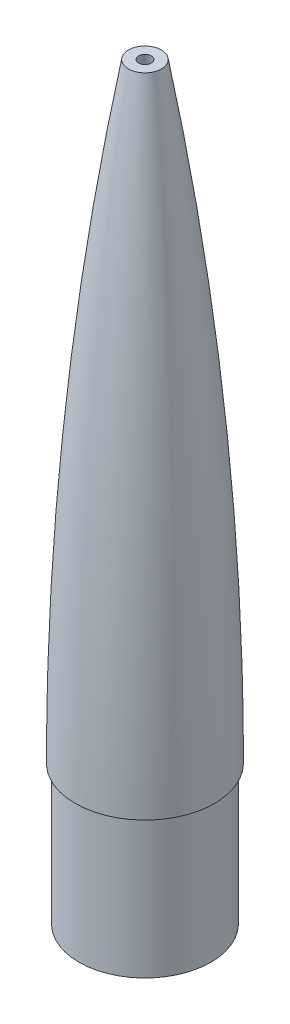
ISO-10303-21;
HEADER;
FILE_DESCRIPTION(('STEP AP214'),'2;1');
FILE_NAME('part.step','',(''),(''),'','','');
FILE_SCHEMA(('AUTOMOTIVE_DESIGN { 1 0 10303 214 1 1 1 1 }'));
ENDSEC;
DATA;
#1=APPLICATION_CONTEXT('core data for automotive mechanical design processes');
#2=APPLICATION_PROTOCOL_DEFINITION('international standard','automotive_design',2000,#1);
#3=PRODUCT_CONTEXT('',#1,'mechanical');
#4=PRODUCT('Part','Part','',(#3));
#5=PRODUCT_RELATED_PRODUCT_CATEGORY('part','',(#4));
#6=PRODUCT_DEFINITION_FORMATION('','',#4);
#7=PRODUCT_DEFINITION_CONTEXT('part definition',#1,'design');
#8=PRODUCT_DEFINITION('design','',#6,#7);
#9=PRODUCT_DEFINITION_SHAPE('','',#8);
#10=(LENGTH_UNIT() NAMED_UNIT(*) SI_UNIT(.MILLI.,.METRE.));
#11=(NAMED_UNIT(*) PLANE_ANGLE_UNIT() SI_UNIT($,.RADIAN.));
#12=(NAMED_UNIT(*) SI_UNIT($,.STERADIAN.) SOLID_ANGLE_UNIT());
#13=UNCERTAINTY_MEASURE_WITH_UNIT(LENGTH_MEASURE(1.E-05),#10,'distance_accuracy_value','');
#14=(GEOMETRIC_REPRESENTATION_CONTEXT(3) GLOBAL_UNCERTAINTY_ASSIGNED_CONTEXT((#13)) GLOBAL_UNIT_ASSIGNED_CONTEXT((#10,
#11,#12)) REPRESENTATION_CONTEXT('',''));
#15=CARTESIAN_POINT('',(0.,0.,0.));
#16=DIRECTION('',(0.,0.,1.));
#17=DIRECTION('',(1.,0.,0.));
#18=AXIS2_PLACEMENT_3D('',#15,#16,#17);
#19=CARTESIAN_POINT('',(0.,0.,0.));
#20=DIRECTION('',(0.,1.,0.));
#21=DIRECTION('',(0.,0.,1.));
#22=AXIS2_PLACEMENT_3D('',#19,#20,#21);
#23=DEGENERATE_TOROIDAL_SURFACE('',#22,1005.84,1023.239,.F.);
#24=CARTESIAN_POINT('',(0.,177.8,0.));
#25=DIRECTION('',(0.,1.,0.));
#26=DIRECTION('',(0.,0.,1.));
#27=AXIS2_PLACEMENT_3D('',#24,#25,#26);
#28=CIRCLE('',#27,1.83316681600676);
#29=CARTESIAN_POINT('',(0.,177.8,1.83316681600676));
#30=VERTEX_POINT('',#29);
#31=EDGE_CURVE('E10',#30,#30,#28,.T.);
#32=ORIENTED_EDGE('',*,*,#31,.T.);
#33=EDGE_LOOP('',(#32));
#34=FACE_BOUND('',#33,.T.);
#35=CARTESIAN_POINT('',(0.,0.,0.));
#36=DIRECTION('',(0.,1.,0.));
#37=DIRECTION('',(0.,0.,1.));
#38=AXIS2_PLACEMENT_3D('',#35,#36,#37);
#39=CIRCLE('',#38,17.399);
#40=CARTESIAN_POINT('',(0.,0.,17.399));
#41=VERTEX_POINT('',#40);
#42=EDGE_CURVE('E56',#41,#41,#39,.T.);
#43=ORIENTED_EDGE('',*,*,#42,.F.);
#44=EDGE_LOOP('',(#43));
#45=FACE_BOUND('',#44,.T.);
#46=ADVANCED_FACE('F31',(#34,#45),#23,.T.);
#47=CARTESIAN_POINT('',(-1.83316681600676,177.8,0.));
#48=DIRECTION('',(0.,1.,0.));
#49=DIRECTION('',(0.,0.,1.));
#50=AXIS2_PLACEMENT_3D('',#47,#48,#49);
#51=PLANE('',#50);
#52=CARTESIAN_POINT('',(0.,177.8,0.));
#53=DIRECTION('',(0.,1.,0.));
#54=DIRECTION('',(0.,0.,1.));
#55=AXIS2_PLACEMENT_3D('',#52,#53,#54);
#56=CIRCLE('',#55,4.79915696948918);
#57=CARTESIAN_POINT('',(0.,177.8,4.79915696948918));
#58=VERTEX_POINT('',#57);
#59=EDGE_CURVE('E37',#58,#58,#56,.T.);
#60=ORIENTED_EDGE('',*,*,#59,.T.);
#61=EDGE_LOOP('',(#60));
#62=FACE_BOUND('',#61,.T.);
#63=ORIENTED_EDGE('',*,*,#31,.F.);
#64=EDGE_LOOP('',(#63));
#65=FACE_BOUND('',#64,.T.);
#66=ADVANCED_FACE('F64',(#62,#65),#51,.T.);
#67=CARTESIAN_POINT('',(0.,0.,0.));
#68=DIRECTION('',(0.,1.,0.));
#69=DIRECTION('',(0.,0.,1.));
#70=AXIS2_PLACEMENT_3D('',#67,#68,#69);
#71=DEGENERATE_TOROIDAL_SURFACE('',#70,1005.84,1026.16,.F.);
#72=CARTESIAN_POINT('',(0.,0.,0.));
#73=DIRECTION('',(0.,1.,0.));
#74=DIRECTION('',(0.,0.,1.));
#75=AXIS2_PLACEMENT_3D('',#72,#73,#74);
#76=CIRCLE('',#75,20.32);
#77=CARTESIAN_POINT('',(0.,0.,20.32));
#78=VERTEX_POINT('',#77);
#79=EDGE_CURVE('E41',#78,#78,#76,.T.);
#80=ORIENTED_EDGE('',*,*,#79,.T.);
#81=EDGE_LOOP('',(#80));
#82=FACE_BOUND('',#81,.T.);
#83=ORIENTED_EDGE('',*,*,#59,.F.);
#84=EDGE_LOOP('',(#83));
#85=FACE_BOUND('',#84,.T.);
#86=ADVANCED_FACE('F68',(#82,#85),#71,.F.);
#87=CARTESIAN_POINT('',(-19.2695651443836,0.,0.));
#88=DIRECTION('',(0.,-1.,0.));
#89=DIRECTION('',(0.,0.,-1.));
#90=AXIS2_PLACEMENT_3D('',#87,#88,#89);
#91=PLANE('',#90);
#92=CARTESIAN_POINT('',(0.,0.,0.));
#93=DIRECTION('',(0.,1.,0.));
#94=DIRECTION('',(0.,0.,1.));
#95=AXIS2_PLACEMENT_3D('',#92,#93,#94);
#96=CIRCLE('',#95,19.2695651443836);
#97=CARTESIAN_POINT('',(0.,0.,19.2695651443836));
#98=VERTEX_POINT('',#97);
#99=EDGE_CURVE('E45',#98,#98,#96,.T.);
#100=ORIENTED_EDGE('',*,*,#99,.T.);
#101=EDGE_LOOP('',(#100));
#102=FACE_BOUND('',#101,.T.);
#103=ORIENTED_EDGE('',*,*,#79,.F.);
#104=EDGE_LOOP('',(#103));
#105=FACE_BOUND('',#104,.T.);
#106=ADVANCED_FACE('F72',(#102,#105),#91,.T.);
#107=CARTESIAN_POINT('',(0.,203.2,0.));
#108=DIRECTION('',(0.,1.,0.));
#109=DIRECTION('',(0.,0.,1.));
#110=AXIS2_PLACEMENT_3D('',#107,#108,#109);
#111=CYLINDRICAL_SURFACE('',#110,19.2695651443836);
#112=CARTESIAN_POINT('',(0.,-40.64,0.));
#113=DIRECTION('',(0.,1.,0.));
#114=DIRECTION('',(0.,0.,1.));
#115=AXIS2_PLACEMENT_3D('',#112,#113,#114);
#116=CIRCLE('',#115,19.2695651443836);
#117=CARTESIAN_POINT('',(0.,-40.64,19.2695651443836));
#118=VERTEX_POINT('',#117);
#119=EDGE_CURVE('E50',#118,#118,#116,.T.);
#120=ORIENTED_EDGE('',*,*,#119,.T.);
#121=EDGE_LOOP('',(#120));
#122=FACE_BOUND('',#121,.T.);
#123=ORIENTED_EDGE('',*,*,#99,.F.);
#124=EDGE_LOOP('',(#123));
#125=FACE_BOUND('',#124,.T.);
#126=ADVANCED_FACE('F79',(#122,#125),#111,.T.);
#127=CARTESIAN_POINT('',(-17.399,-40.64,0.));
#128=DIRECTION('',(0.,-1.,0.));
#129=DIRECTION('',(0.,0.,-1.));
#130=AXIS2_PLACEMENT_3D('',#127,#128,#129);
#131=PLANE('',#130);
#132=CARTESIAN_POINT('',(0.,-40.64,0.));
#133=DIRECTION('',(0.,1.,0.));
#134=DIRECTION('',(0.,0.,1.));
#135=AXIS2_PLACEMENT_3D('',#132,#133,#134);
#136=CIRCLE('',#135,17.399);
#137=CARTESIAN_POINT('',(0.,-40.64,17.399));
#138=VERTEX_POINT('',#137);
#139=EDGE_CURVE('E53',#138,#138,#136,.T.);
#140=ORIENTED_EDGE('',*,*,#139,.T.);
#141=EDGE_LOOP('',(#140));
#142=FACE_BOUND('',#141,.T.);
#143=ORIENTED_EDGE('',*,*,#119,.F.);
#144=EDGE_LOOP('',(#143));
#145=FACE_BOUND('',#144,.T.);
#146=ADVANCED_FACE('F83',(#142,#145),#131,.T.);
#147=CARTESIAN_POINT('',(0.,203.2,0.));
#148=DIRECTION('',(0.,1.,0.));
#149=DIRECTION('',(0.,0.,1.));
#150=AXIS2_PLACEMENT_3D('',#147,#148,#149);
#151=CYLINDRICAL_SURFACE('',#150,17.399);
#152=ORIENTED_EDGE('',*,*,#42,.T.);
#153=EDGE_LOOP('',(#152));
#154=FACE_BOUND('',#153,.T.);
#155=ORIENTED_EDGE('',*,*,#139,.F.);
#156=EDGE_LOOP('',(#155));
#157=FACE_BOUND('',#156,.T.);
#158=ADVANCED_FACE('F60',(#154,#157),#151,.F.);
#159=CLOSED_SHELL('',(#46,#66,#86,#106,#126,#146,#158));
#160=MANIFOLD_SOLID_BREP('B2',#159);
#161=ADVANCED_BREP_SHAPE_REPRESENTATION('',(#18,#160),#14);
#162=SHAPE_DEFINITION_REPRESENTATION(#9,#161);
ENDSEC;
END-ISO-10303-21;
